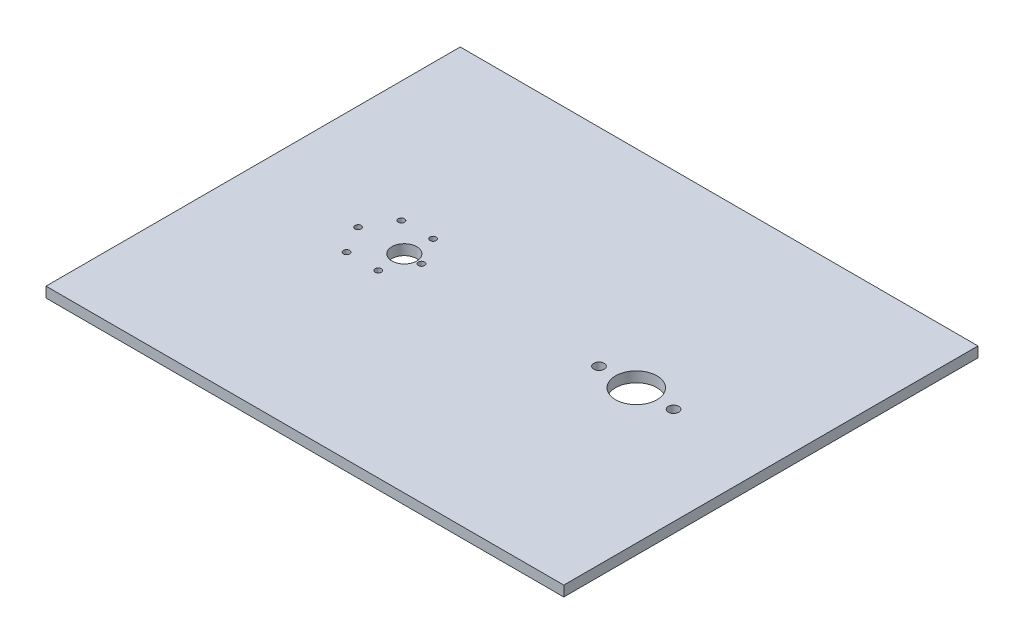
ISO-10303-21;
HEADER;
FILE_DESCRIPTION(('STEP AP214'),'2;1');
FILE_NAME('part.step','',(''),(''),'','','');
FILE_SCHEMA(('AUTOMOTIVE_DESIGN { 1 0 10303 214 1 1 1 1 }'));
ENDSEC;
DATA;
#1=APPLICATION_CONTEXT('core data for automotive mechanical design processes');
#2=APPLICATION_PROTOCOL_DEFINITION('international standard','automotive_design',2000,#1);
#3=PRODUCT_CONTEXT('',#1,'mechanical');
#4=PRODUCT('Part','Part','',(#3));
#5=PRODUCT_RELATED_PRODUCT_CATEGORY('part','',(#4));
#6=PRODUCT_DEFINITION_FORMATION('','',#4);
#7=PRODUCT_DEFINITION_CONTEXT('part definition',#1,'design');
#8=PRODUCT_DEFINITION('design','',#6,#7);
#9=PRODUCT_DEFINITION_SHAPE('','',#8);
#10=(LENGTH_UNIT() NAMED_UNIT(*) SI_UNIT(.MILLI.,.METRE.));
#11=(NAMED_UNIT(*) PLANE_ANGLE_UNIT() SI_UNIT($,.RADIAN.));
#12=(NAMED_UNIT(*) SI_UNIT($,.STERADIAN.) SOLID_ANGLE_UNIT());
#13=UNCERTAINTY_MEASURE_WITH_UNIT(LENGTH_MEASURE(1.E-05),#10,'distance_accuracy_value','');
#14=(GEOMETRIC_REPRESENTATION_CONTEXT(3) GLOBAL_UNCERTAINTY_ASSIGNED_CONTEXT((#13)) GLOBAL_UNIT_ASSIGNED_CONTEXT((#10,
#11,#12)) REPRESENTATION_CONTEXT('',''));
#15=CARTESIAN_POINT('',(0.,0.,0.));
#16=DIRECTION('',(0.,0.,1.));
#17=DIRECTION('',(1.,0.,0.));
#18=AXIS2_PLACEMENT_3D('',#15,#16,#17);
#19=CARTESIAN_POINT('',(0.,5.,0.));
#20=DIRECTION('',(0.,1.,0.));
#21=DIRECTION('',(0.,0.,1.));
#22=AXIS2_PLACEMENT_3D('',#19,#20,#21);
#23=PLANE('',#22);
#24=CARTESIAN_POINT('',(-66.6500000000001,5.,-13.2501886779019));
#25=DIRECTION('',(0.,1.,0.));
#26=DIRECTION('',(0.,0.,1.));
#27=AXIS2_PLACEMENT_3D('',#24,#25,#26);
#28=CIRCLE('',#27,1.5);
#29=CARTESIAN_POINT('',(-66.6500000000001,5.,-11.7501886779019));
#30=VERTEX_POINT('',#29);
#31=EDGE_CURVE('E157',#30,#30,#28,.T.);
#32=ORIENTED_EDGE('',*,*,#31,.F.);
#33=EDGE_LOOP('',(#32));
#34=FACE_BOUND('',#33,.T.);
#35=CARTESIAN_POINT('',(-66.6500000000001,5.,13.2501886779019));
#36=DIRECTION('',(0.,1.,0.));
#37=DIRECTION('',(0.,0.,1.));
#38=AXIS2_PLACEMENT_3D('',#35,#36,#37);
#39=CIRCLE('',#38,1.5);
#40=CARTESIAN_POINT('',(-66.6500000000001,5.,14.7501886779019));
#41=VERTEX_POINT('',#40);
#42=EDGE_CURVE('E145',#41,#41,#39,.T.);
#43=ORIENTED_EDGE('',*,*,#42,.F.);
#44=EDGE_LOOP('',(#43));
#45=FACE_BOUND('',#44,.T.);
#46=CARTESIAN_POINT('',(-52.0000000000001,5.,0.));
#47=DIRECTION('',(0.,1.,0.));
#48=DIRECTION('',(0.,0.,1.));
#49=AXIS2_PLACEMENT_3D('',#46,#47,#48);
#50=CIRCLE('',#49,6.);
#51=CARTESIAN_POINT('',(-52.0000000000001,5.,6.));
#52=VERTEX_POINT('',#51);
#53=EDGE_CURVE('E133',#52,#52,#50,.T.);
#54=ORIENTED_EDGE('',*,*,#53,.F.);
#55=EDGE_LOOP('',(#54));
#56=FACE_BOUND('',#55,.T.);
#57=CARTESIAN_POINT('',(41.9999999999999,5.,0.));
#58=DIRECTION('',(0.,1.,0.));
#59=DIRECTION('',(0.,0.,1.));
#60=AXIS2_PLACEMENT_3D('',#57,#58,#59);
#61=CIRCLE('',#60,2.49999999999999);
#62=CARTESIAN_POINT('',(41.9999999999999,5.,2.49999999999999));
#63=VERTEX_POINT('',#62);
#64=EDGE_CURVE('E121',#63,#63,#61,.T.);
#65=ORIENTED_EDGE('',*,*,#64,.F.);
#66=EDGE_LOOP('',(#65));
#67=FACE_BOUND('',#66,.T.);
#68=CARTESIAN_POINT('',(59.9999999999999,5.,0.));
#69=DIRECTION('',(0.,1.,0.));
#70=DIRECTION('',(0.,0.,1.));
#71=AXIS2_PLACEMENT_3D('',#68,#69,#70);
#72=CIRCLE('',#71,9.99999999999999);
#73=CARTESIAN_POINT('',(59.9999999999999,5.,9.99999999999999));
#74=VERTEX_POINT('',#73);
#75=EDGE_CURVE('E100',#74,#74,#72,.T.);
#76=ORIENTED_EDGE('',*,*,#75,.F.);
#77=EDGE_LOOP('',(#76));
#78=FACE_BOUND('',#77,.T.);
#79=DIRECTION('',(0.,0.,-1.));
#80=VECTOR('',#79,1.);
#81=CARTESIAN_POINT('',(125.,5.,-99.9999999999999));
#82=LINE('',#81,#80);
#83=CARTESIAN_POINT('',(125.,5.,100.));
#84=VERTEX_POINT('',#83);
#85=CARTESIAN_POINT('',(125.,5.,-99.9999999999999));
#86=VERTEX_POINT('',#85);
#87=EDGE_CURVE('E85',#84,#86,#82,.T.);
#88=ORIENTED_EDGE('',*,*,#87,.T.);
#89=DIRECTION('',(-1.,0.,0.));
#90=VECTOR('',#89,1.);
#91=CARTESIAN_POINT('',(-125.,5.,-100.));
#92=LINE('',#91,#90);
#93=CARTESIAN_POINT('',(-125.,5.,-100.));
#94=VERTEX_POINT('',#93);
#95=EDGE_CURVE('E80',#86,#94,#92,.T.);
#96=ORIENTED_EDGE('',*,*,#95,.T.);
#97=DIRECTION('',(0.,0.,1.));
#98=VECTOR('',#97,1.);
#99=CARTESIAN_POINT('',(-125.,5.,-100.));
#100=LINE('',#99,#98);
#101=CARTESIAN_POINT('',(-125.,5.,100.));
#102=VERTEX_POINT('',#101);
#103=EDGE_CURVE('E83',#94,#102,#100,.T.);
#104=ORIENTED_EDGE('',*,*,#103,.T.);
#105=DIRECTION('',(1.,0.,0.));
#106=VECTOR('',#105,1.);
#107=CARTESIAN_POINT('',(-125.,5.,100.));
#108=LINE('',#107,#106);
#109=EDGE_CURVE('E50',#102,#84,#108,.T.);
#110=ORIENTED_EDGE('',*,*,#109,.T.);
#111=EDGE_LOOP('',(#88,#96,#104,#110));
#112=FACE_BOUND('',#111,.T.);
#113=CARTESIAN_POINT('',(77.9999999999999,5.,0.));
#114=DIRECTION('',(0.,1.,0.));
#115=DIRECTION('',(0.,0.,1.));
#116=AXIS2_PLACEMENT_3D('',#113,#114,#115);
#117=CIRCLE('',#116,2.5);
#118=CARTESIAN_POINT('',(77.9999999999999,5.,2.5));
#119=VERTEX_POINT('',#118);
#120=EDGE_CURVE('E115',#119,#119,#117,.T.);
#121=ORIENTED_EDGE('',*,*,#120,.F.);
#122=EDGE_LOOP('',(#121));
#123=FACE_BOUND('',#122,.T.);
#124=CARTESIAN_POINT('',(-43.7000000000001,5.,0.));
#125=DIRECTION('',(0.,1.,0.));
#126=DIRECTION('',(0.,0.,1.));
#127=AXIS2_PLACEMENT_3D('',#124,#125,#126);
#128=CIRCLE('',#127,1.5);
#129=CARTESIAN_POINT('',(-43.7000000000001,5.,1.5));
#130=VERTEX_POINT('',#129);
#131=EDGE_CURVE('E127',#130,#130,#128,.T.);
#132=ORIENTED_EDGE('',*,*,#131,.F.);
#133=EDGE_LOOP('',(#132));
#134=FACE_BOUND('',#133,.T.);
#135=CARTESIAN_POINT('',(-51.3500000000001,5.,13.2501886779019));
#136=DIRECTION('',(0.,1.,0.));
#137=DIRECTION('',(0.,0.,1.));
#138=AXIS2_PLACEMENT_3D('',#135,#136,#137);
#139=CIRCLE('',#138,1.5);
#140=CARTESIAN_POINT('',(-51.3500000000001,5.,14.7501886779019));
#141=VERTEX_POINT('',#140);
#142=EDGE_CURVE('E139',#141,#141,#139,.T.);
#143=ORIENTED_EDGE('',*,*,#142,.F.);
#144=EDGE_LOOP('',(#143));
#145=FACE_BOUND('',#144,.T.);
#146=CARTESIAN_POINT('',(-74.3000000000001,5.,0.));
#147=DIRECTION('',(0.,1.,0.));
#148=DIRECTION('',(0.,0.,1.));
#149=AXIS2_PLACEMENT_3D('',#146,#147,#148);
#150=CIRCLE('',#149,1.5);
#151=CARTESIAN_POINT('',(-74.3000000000001,5.,1.5));
#152=VERTEX_POINT('',#151);
#153=EDGE_CURVE('E151',#152,#152,#150,.T.);
#154=ORIENTED_EDGE('',*,*,#153,.F.);
#155=EDGE_LOOP('',(#154));
#156=FACE_BOUND('',#155,.T.);
#157=CARTESIAN_POINT('',(-51.3500000000001,5.,-13.2501886779019));
#158=DIRECTION('',(0.,1.,0.));
#159=DIRECTION('',(0.,0.,1.));
#160=AXIS2_PLACEMENT_3D('',#157,#158,#159);
#161=CIRCLE('',#160,1.5);
#162=CARTESIAN_POINT('',(-51.3500000000001,5.,-11.7501886779019));
#163=VERTEX_POINT('',#162);
#164=EDGE_CURVE('E163',#163,#163,#161,.T.);
#165=ORIENTED_EDGE('',*,*,#164,.F.);
#166=EDGE_LOOP('',(#165));
#167=FACE_BOUND('',#166,.T.);
#168=ADVANCED_FACE('F33',(#34,#45,#56,#67,#78,#112,#123,#134,#145,#156,#167),#23,.T.);
#169=CARTESIAN_POINT('',(0.,0.,0.));
#170=DIRECTION('',(0.,1.,0.));
#171=DIRECTION('',(0.,0.,1.));
#172=AXIS2_PLACEMENT_3D('',#169,#170,#171);
#173=PLANE('',#172);
#174=DIRECTION('',(0.,0.,-1.));
#175=VECTOR('',#174,1.);
#176=CARTESIAN_POINT('',(125.,0.,-99.9999999999999));
#177=LINE('',#176,#175);
#178=CARTESIAN_POINT('',(125.,0.,100.));
#179=VERTEX_POINT('',#178);
#180=CARTESIAN_POINT('',(125.,0.,-99.9999999999999));
#181=VERTEX_POINT('',#180);
#182=EDGE_CURVE('E97',#179,#181,#177,.T.);
#183=ORIENTED_EDGE('',*,*,#182,.F.);
#184=DIRECTION('',(1.,0.,0.));
#185=VECTOR('',#184,1.);
#186=CARTESIAN_POINT('',(-125.,0.,100.));
#187=LINE('',#186,#185);
#188=CARTESIAN_POINT('',(-125.,0.,100.));
#189=VERTEX_POINT('',#188);
#190=EDGE_CURVE('E73',#189,#179,#187,.T.);
#191=ORIENTED_EDGE('',*,*,#190,.F.);
#192=DIRECTION('',(0.,0.,1.));
#193=VECTOR('',#192,1.);
#194=CARTESIAN_POINT('',(-125.,0.,-100.));
#195=LINE('',#194,#193);
#196=CARTESIAN_POINT('',(-125.,0.,-100.));
#197=VERTEX_POINT('',#196);
#198=EDGE_CURVE('E67',#197,#189,#195,.T.);
#199=ORIENTED_EDGE('',*,*,#198,.F.);
#200=DIRECTION('',(-1.,0.,0.));
#201=VECTOR('',#200,1.);
#202=CARTESIAN_POINT('',(-125.,0.,-100.));
#203=LINE('',#202,#201);
#204=EDGE_CURVE('E89',#181,#197,#203,.T.);
#205=ORIENTED_EDGE('',*,*,#204,.F.);
#206=EDGE_LOOP('',(#183,#191,#199,#205));
#207=FACE_BOUND('',#206,.T.);
#208=CARTESIAN_POINT('',(59.9999999999999,0.,0.));
#209=DIRECTION('',(0.,1.,0.));
#210=DIRECTION('',(0.,0.,1.));
#211=AXIS2_PLACEMENT_3D('',#208,#209,#210);
#212=CIRCLE('',#211,9.99999999999999);
#213=CARTESIAN_POINT('',(59.9999999999999,0.,9.99999999999999));
#214=VERTEX_POINT('',#213);
#215=EDGE_CURVE('E112',#214,#214,#212,.T.);
#216=ORIENTED_EDGE('',*,*,#215,.T.);
#217=EDGE_LOOP('',(#216));
#218=FACE_BOUND('',#217,.T.);
#219=CARTESIAN_POINT('',(77.9999999999999,0.,0.));
#220=DIRECTION('',(0.,1.,0.));
#221=DIRECTION('',(0.,0.,1.));
#222=AXIS2_PLACEMENT_3D('',#219,#220,#221);
#223=CIRCLE('',#222,2.5);
#224=CARTESIAN_POINT('',(77.9999999999999,0.,2.5));
#225=VERTEX_POINT('',#224);
#226=EDGE_CURVE('E118',#225,#225,#223,.T.);
#227=ORIENTED_EDGE('',*,*,#226,.T.);
#228=EDGE_LOOP('',(#227));
#229=FACE_BOUND('',#228,.T.);
#230=CARTESIAN_POINT('',(41.9999999999999,0.,0.));
#231=DIRECTION('',(0.,1.,0.));
#232=DIRECTION('',(0.,0.,1.));
#233=AXIS2_PLACEMENT_3D('',#230,#231,#232);
#234=CIRCLE('',#233,2.49999999999999);
#235=CARTESIAN_POINT('',(41.9999999999999,0.,2.49999999999999));
#236=VERTEX_POINT('',#235);
#237=EDGE_CURVE('E124',#236,#236,#234,.T.);
#238=ORIENTED_EDGE('',*,*,#237,.T.);
#239=EDGE_LOOP('',(#238));
#240=FACE_BOUND('',#239,.T.);
#241=CARTESIAN_POINT('',(-43.7000000000001,0.,0.));
#242=DIRECTION('',(0.,1.,0.));
#243=DIRECTION('',(0.,0.,1.));
#244=AXIS2_PLACEMENT_3D('',#241,#242,#243);
#245=CIRCLE('',#244,1.5);
#246=CARTESIAN_POINT('',(-43.7000000000001,0.,1.5));
#247=VERTEX_POINT('',#246);
#248=EDGE_CURVE('E130',#247,#247,#245,.T.);
#249=ORIENTED_EDGE('',*,*,#248,.T.);
#250=EDGE_LOOP('',(#249));
#251=FACE_BOUND('',#250,.T.);
#252=CARTESIAN_POINT('',(-52.0000000000001,0.,0.));
#253=DIRECTION('',(0.,1.,0.));
#254=DIRECTION('',(0.,0.,1.));
#255=AXIS2_PLACEMENT_3D('',#252,#253,#254);
#256=CIRCLE('',#255,6.);
#257=CARTESIAN_POINT('',(-52.0000000000001,0.,6.));
#258=VERTEX_POINT('',#257);
#259=EDGE_CURVE('E136',#258,#258,#256,.T.);
#260=ORIENTED_EDGE('',*,*,#259,.T.);
#261=EDGE_LOOP('',(#260));
#262=FACE_BOUND('',#261,.T.);
#263=CARTESIAN_POINT('',(-51.3500000000001,0.,13.2501886779019));
#264=DIRECTION('',(0.,1.,0.));
#265=DIRECTION('',(0.,0.,1.));
#266=AXIS2_PLACEMENT_3D('',#263,#264,#265);
#267=CIRCLE('',#266,1.5);
#268=CARTESIAN_POINT('',(-51.3500000000001,0.,14.7501886779019));
#269=VERTEX_POINT('',#268);
#270=EDGE_CURVE('E142',#269,#269,#267,.T.);
#271=ORIENTED_EDGE('',*,*,#270,.T.);
#272=EDGE_LOOP('',(#271));
#273=FACE_BOUND('',#272,.T.);
#274=CARTESIAN_POINT('',(-66.6500000000001,0.,13.2501886779019));
#275=DIRECTION('',(0.,1.,0.));
#276=DIRECTION('',(0.,0.,1.));
#277=AXIS2_PLACEMENT_3D('',#274,#275,#276);
#278=CIRCLE('',#277,1.5);
#279=CARTESIAN_POINT('',(-66.6500000000001,0.,14.7501886779019));
#280=VERTEX_POINT('',#279);
#281=EDGE_CURVE('E148',#280,#280,#278,.T.);
#282=ORIENTED_EDGE('',*,*,#281,.T.);
#283=EDGE_LOOP('',(#282));
#284=FACE_BOUND('',#283,.T.);
#285=CARTESIAN_POINT('',(-74.3000000000001,0.,0.));
#286=DIRECTION('',(0.,1.,0.));
#287=DIRECTION('',(0.,0.,1.));
#288=AXIS2_PLACEMENT_3D('',#285,#286,#287);
#289=CIRCLE('',#288,1.5);
#290=CARTESIAN_POINT('',(-74.3000000000001,0.,1.5));
#291=VERTEX_POINT('',#290);
#292=EDGE_CURVE('E154',#291,#291,#289,.T.);
#293=ORIENTED_EDGE('',*,*,#292,.T.);
#294=EDGE_LOOP('',(#293));
#295=FACE_BOUND('',#294,.T.);
#296=CARTESIAN_POINT('',(-66.6500000000001,0.,-13.2501886779019));
#297=DIRECTION('',(0.,1.,0.));
#298=DIRECTION('',(0.,0.,1.));
#299=AXIS2_PLACEMENT_3D('',#296,#297,#298);
#300=CIRCLE('',#299,1.5);
#301=CARTESIAN_POINT('',(-66.6500000000001,0.,-11.7501886779019));
#302=VERTEX_POINT('',#301);
#303=EDGE_CURVE('E160',#302,#302,#300,.T.);
#304=ORIENTED_EDGE('',*,*,#303,.T.);
#305=EDGE_LOOP('',(#304));
#306=FACE_BOUND('',#305,.T.);
#307=CARTESIAN_POINT('',(-51.3500000000001,0.,-13.2501886779019));
#308=DIRECTION('',(0.,1.,0.));
#309=DIRECTION('',(0.,0.,1.));
#310=AXIS2_PLACEMENT_3D('',#307,#308,#309);
#311=CIRCLE('',#310,1.5);
#312=CARTESIAN_POINT('',(-51.3500000000001,0.,-11.7501886779019));
#313=VERTEX_POINT('',#312);
#314=EDGE_CURVE('E166',#313,#313,#311,.T.);
#315=ORIENTED_EDGE('',*,*,#314,.T.);
#316=EDGE_LOOP('',(#315));
#317=FACE_BOUND('',#316,.T.);
#318=ADVANCED_FACE('F108',(#207,#218,#229,#240,#251,#262,#273,#284,#295,#306,#317),#173,.F.);
#319=CARTESIAN_POINT('',(125.,5.,-99.9999999999999));
#320=DIRECTION('',(-1.,0.,0.));
#321=DIRECTION('',(0.,0.,1.));
#322=AXIS2_PLACEMENT_3D('',#319,#320,#321);
#323=PLANE('',#322);
#324=ORIENTED_EDGE('',*,*,#182,.T.);
#325=DIRECTION('',(0.,-1.,0.));
#326=VECTOR('',#325,1.);
#327=CARTESIAN_POINT('',(125.,5.,-99.9999999999999));
#328=LINE('',#327,#326);
#329=EDGE_CURVE('E11',#86,#181,#328,.T.);
#330=ORIENTED_EDGE('',*,*,#329,.F.);
#331=ORIENTED_EDGE('',*,*,#87,.F.);
#332=DIRECTION('',(0.,-1.,0.));
#333=VECTOR('',#332,1.);
#334=CARTESIAN_POINT('',(125.,5.,100.));
#335=LINE('',#334,#333);
#336=EDGE_CURVE('E93',#84,#179,#335,.T.);
#337=ORIENTED_EDGE('',*,*,#336,.T.);
#338=EDGE_LOOP('',(#324,#330,#331,#337));
#339=FACE_BOUND('',#338,.T.);
#340=ADVANCED_FACE('F35',(#339),#323,.F.);
#341=CARTESIAN_POINT('',(-125.,5.,-100.));
#342=DIRECTION('',(0.,0.,1.));
#343=DIRECTION('',(1.,0.,0.));
#344=AXIS2_PLACEMENT_3D('',#341,#342,#343);
#345=PLANE('',#344);
#346=ORIENTED_EDGE('',*,*,#204,.T.);
#347=DIRECTION('',(0.,-1.,0.));
#348=VECTOR('',#347,1.);
#349=CARTESIAN_POINT('',(-125.,5.,-100.));
#350=LINE('',#349,#348);
#351=EDGE_CURVE('E42',#94,#197,#350,.T.);
#352=ORIENTED_EDGE('',*,*,#351,.F.);
#353=ORIENTED_EDGE('',*,*,#95,.F.);
#354=ORIENTED_EDGE('',*,*,#329,.T.);
#355=EDGE_LOOP('',(#346,#352,#353,#354));
#356=FACE_BOUND('',#355,.T.);
#357=ADVANCED_FACE('F88',(#356),#345,.F.);
#358=CARTESIAN_POINT('',(-125.,5.,-100.));
#359=DIRECTION('',(1.,0.,0.));
#360=DIRECTION('',(0.,0.,-1.));
#361=AXIS2_PLACEMENT_3D('',#358,#359,#360);
#362=PLANE('',#361);
#363=ORIENTED_EDGE('',*,*,#198,.T.);
#364=DIRECTION('',(0.,-1.,0.));
#365=VECTOR('',#364,1.);
#366=CARTESIAN_POINT('',(-125.,5.,100.));
#367=LINE('',#366,#365);
#368=EDGE_CURVE('E90',#102,#189,#367,.T.);
#369=ORIENTED_EDGE('',*,*,#368,.F.);
#370=ORIENTED_EDGE('',*,*,#103,.F.);
#371=ORIENTED_EDGE('',*,*,#351,.T.);
#372=EDGE_LOOP('',(#363,#369,#370,#371));
#373=FACE_BOUND('',#372,.T.);
#374=ADVANCED_FACE('F91',(#373),#362,.F.);
#375=CARTESIAN_POINT('',(-125.,5.,100.));
#376=DIRECTION('',(0.,0.,-1.));
#377=DIRECTION('',(-1.,0.,0.));
#378=AXIS2_PLACEMENT_3D('',#375,#376,#377);
#379=PLANE('',#378);
#380=ORIENTED_EDGE('',*,*,#190,.T.);
#381=ORIENTED_EDGE('',*,*,#336,.F.);
#382=ORIENTED_EDGE('',*,*,#109,.F.);
#383=ORIENTED_EDGE('',*,*,#368,.T.);
#384=EDGE_LOOP('',(#380,#381,#382,#383));
#385=FACE_BOUND('',#384,.T.);
#386=ADVANCED_FACE('F105',(#385),#379,.F.);
#387=CARTESIAN_POINT('',(59.9999999999999,5.,0.));
#388=DIRECTION('',(0.,-1.,0.));
#389=DIRECTION('',(0.,0.,-1.));
#390=AXIS2_PLACEMENT_3D('',#387,#388,#389);
#391=CYLINDRICAL_SURFACE('',#390,9.99999999999999);
#392=ORIENTED_EDGE('',*,*,#75,.T.);
#393=EDGE_LOOP('',(#392));
#394=FACE_BOUND('',#393,.T.);
#395=ORIENTED_EDGE('',*,*,#215,.F.);
#396=EDGE_LOOP('',(#395));
#397=FACE_BOUND('',#396,.T.);
#398=ADVANCED_FACE('F185',(#394,#397),#391,.F.);
#399=CARTESIAN_POINT('',(77.9999999999999,5.,0.));
#400=DIRECTION('',(0.,-1.,0.));
#401=DIRECTION('',(0.,0.,-1.));
#402=AXIS2_PLACEMENT_3D('',#399,#400,#401);
#403=CYLINDRICAL_SURFACE('',#402,2.5);
#404=ORIENTED_EDGE('',*,*,#120,.T.);
#405=EDGE_LOOP('',(#404));
#406=FACE_BOUND('',#405,.T.);
#407=ORIENTED_EDGE('',*,*,#226,.F.);
#408=EDGE_LOOP('',(#407));
#409=FACE_BOUND('',#408,.T.);
#410=ADVANCED_FACE('F231',(#406,#409),#403,.F.);
#411=CARTESIAN_POINT('',(41.9999999999999,5.,0.));
#412=DIRECTION('',(0.,-1.,0.));
#413=DIRECTION('',(0.,0.,-1.));
#414=AXIS2_PLACEMENT_3D('',#411,#412,#413);
#415=CYLINDRICAL_SURFACE('',#414,2.49999999999999);
#416=ORIENTED_EDGE('',*,*,#64,.T.);
#417=EDGE_LOOP('',(#416));
#418=FACE_BOUND('',#417,.T.);
#419=ORIENTED_EDGE('',*,*,#237,.F.);
#420=EDGE_LOOP('',(#419));
#421=FACE_BOUND('',#420,.T.);
#422=ADVANCED_FACE('F239',(#418,#421),#415,.F.);
#423=CARTESIAN_POINT('',(-43.7000000000001,5.,0.));
#424=DIRECTION('',(0.,-1.,0.));
#425=DIRECTION('',(0.,0.,-1.));
#426=AXIS2_PLACEMENT_3D('',#423,#424,#425);
#427=CYLINDRICAL_SURFACE('',#426,1.5);
#428=ORIENTED_EDGE('',*,*,#131,.T.);
#429=EDGE_LOOP('',(#428));
#430=FACE_BOUND('',#429,.T.);
#431=ORIENTED_EDGE('',*,*,#248,.F.);
#432=EDGE_LOOP('',(#431));
#433=FACE_BOUND('',#432,.T.);
#434=ADVANCED_FACE('F247',(#430,#433),#427,.F.);
#435=CARTESIAN_POINT('',(-52.0000000000001,5.,0.));
#436=DIRECTION('',(0.,-1.,0.));
#437=DIRECTION('',(0.,0.,-1.));
#438=AXIS2_PLACEMENT_3D('',#435,#436,#437);
#439=CYLINDRICAL_SURFACE('',#438,6.);
#440=ORIENTED_EDGE('',*,*,#53,.T.);
#441=EDGE_LOOP('',(#440));
#442=FACE_BOUND('',#441,.T.);
#443=ORIENTED_EDGE('',*,*,#259,.F.);
#444=EDGE_LOOP('',(#443));
#445=FACE_BOUND('',#444,.T.);
#446=ADVANCED_FACE('F256',(#442,#445),#439,.F.);
#447=CARTESIAN_POINT('',(-51.3500000000001,5.,13.2501886779019));
#448=DIRECTION('',(0.,-1.,0.));
#449=DIRECTION('',(0.,0.,-1.));
#450=AXIS2_PLACEMENT_3D('',#447,#448,#449);
#451=CYLINDRICAL_SURFACE('',#450,1.5);
#452=ORIENTED_EDGE('',*,*,#142,.T.);
#453=EDGE_LOOP('',(#452));
#454=FACE_BOUND('',#453,.T.);
#455=ORIENTED_EDGE('',*,*,#270,.F.);
#456=EDGE_LOOP('',(#455));
#457=FACE_BOUND('',#456,.T.);
#458=ADVANCED_FACE('F265',(#454,#457),#451,.F.);
#459=CARTESIAN_POINT('',(-66.6500000000001,5.,13.2501886779019));
#460=DIRECTION('',(0.,-1.,0.));
#461=DIRECTION('',(0.,0.,-1.));
#462=AXIS2_PLACEMENT_3D('',#459,#460,#461);
#463=CYLINDRICAL_SURFACE('',#462,1.5);
#464=ORIENTED_EDGE('',*,*,#42,.T.);
#465=EDGE_LOOP('',(#464));
#466=FACE_BOUND('',#465,.T.);
#467=ORIENTED_EDGE('',*,*,#281,.F.);
#468=EDGE_LOOP('',(#467));
#469=FACE_BOUND('',#468,.T.);
#470=ADVANCED_FACE('F274',(#466,#469),#463,.F.);
#471=CARTESIAN_POINT('',(-74.3000000000001,5.,0.));
#472=DIRECTION('',(0.,-1.,0.));
#473=DIRECTION('',(0.,0.,-1.));
#474=AXIS2_PLACEMENT_3D('',#471,#472,#473);
#475=CYLINDRICAL_SURFACE('',#474,1.5);
#476=ORIENTED_EDGE('',*,*,#153,.T.);
#477=EDGE_LOOP('',(#476));
#478=FACE_BOUND('',#477,.T.);
#479=ORIENTED_EDGE('',*,*,#292,.F.);
#480=EDGE_LOOP('',(#479));
#481=FACE_BOUND('',#480,.T.);
#482=ADVANCED_FACE('F283',(#478,#481),#475,.F.);
#483=CARTESIAN_POINT('',(-66.6500000000001,5.,-13.2501886779019));
#484=DIRECTION('',(0.,-1.,0.));
#485=DIRECTION('',(0.,0.,-1.));
#486=AXIS2_PLACEMENT_3D('',#483,#484,#485);
#487=CYLINDRICAL_SURFACE('',#486,1.5);
#488=ORIENTED_EDGE('',*,*,#31,.T.);
#489=EDGE_LOOP('',(#488));
#490=FACE_BOUND('',#489,.T.);
#491=ORIENTED_EDGE('',*,*,#303,.F.);
#492=EDGE_LOOP('',(#491));
#493=FACE_BOUND('',#492,.T.);
#494=ADVANCED_FACE('F292',(#490,#493),#487,.F.);
#495=CARTESIAN_POINT('',(-51.3500000000001,5.,-13.2501886779019));
#496=DIRECTION('',(0.,-1.,0.));
#497=DIRECTION('',(0.,0.,-1.));
#498=AXIS2_PLACEMENT_3D('',#495,#496,#497);
#499=CYLINDRICAL_SURFACE('',#498,1.5);
#500=ORIENTED_EDGE('',*,*,#164,.T.);
#501=EDGE_LOOP('',(#500));
#502=FACE_BOUND('',#501,.T.);
#503=ORIENTED_EDGE('',*,*,#314,.F.);
#504=EDGE_LOOP('',(#503));
#505=FACE_BOUND('',#504,.T.);
#506=ADVANCED_FACE('F172',(#502,#505),#499,.F.);
#507=CLOSED_SHELL('',(#168,#318,#340,#357,#374,#386,#398,#410,#422,#434,#446,#458,#470,#482,
#494,#506));
#508=MANIFOLD_SOLID_BREP('B2',#507);
#509=ADVANCED_BREP_SHAPE_REPRESENTATION('',(#18,#508),#14);
#510=SHAPE_DEFINITION_REPRESENTATION(#9,#509);
ENDSEC;
END-ISO-10303-21;
